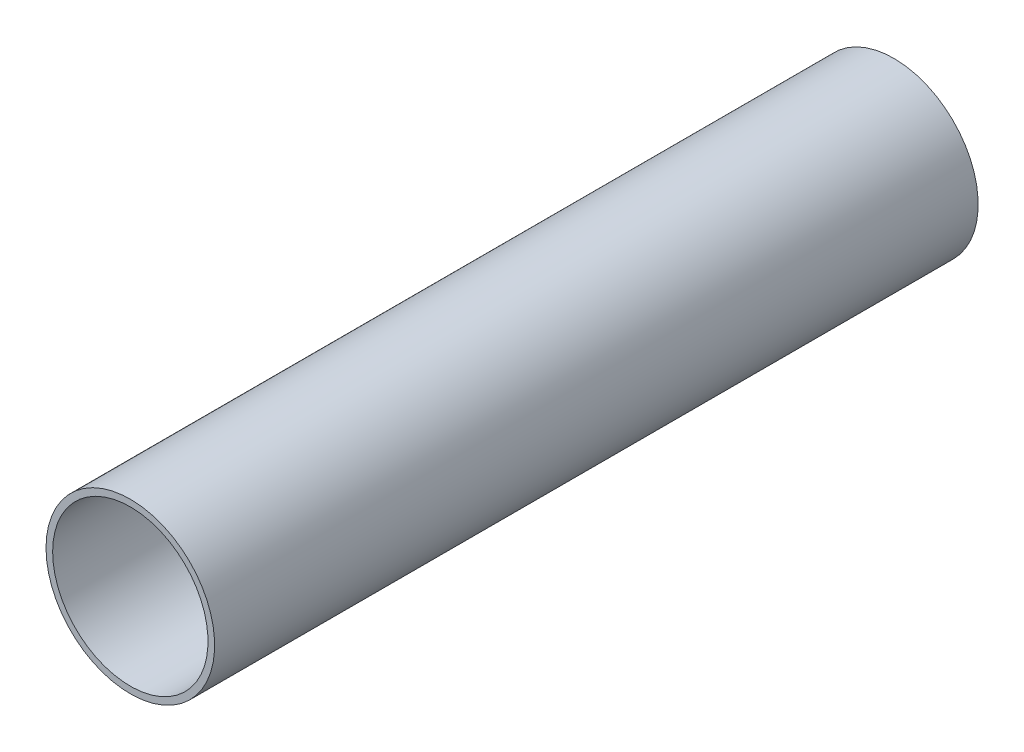
ISO-10303-21;
HEADER;
FILE_DESCRIPTION(('STEP AP214'),'2;1');
FILE_NAME('part.step','',(''),(''),'','','');
FILE_SCHEMA(('AUTOMOTIVE_DESIGN { 1 0 10303 214 1 1 1 1 }'));
ENDSEC;
DATA;
#1=APPLICATION_CONTEXT('core data for automotive mechanical design processes');
#2=APPLICATION_PROTOCOL_DEFINITION('international standard','automotive_design',2000,#1);
#3=PRODUCT_CONTEXT('',#1,'mechanical');
#4=PRODUCT('Part','Part','',(#3));
#5=PRODUCT_RELATED_PRODUCT_CATEGORY('part','',(#4));
#6=PRODUCT_DEFINITION_FORMATION('','',#4);
#7=PRODUCT_DEFINITION_CONTEXT('part definition',#1,'design');
#8=PRODUCT_DEFINITION('design','',#6,#7);
#9=PRODUCT_DEFINITION_SHAPE('','',#8);
#10=(LENGTH_UNIT() NAMED_UNIT(*) SI_UNIT(.MILLI.,.METRE.));
#11=(NAMED_UNIT(*) PLANE_ANGLE_UNIT() SI_UNIT($,.RADIAN.));
#12=(NAMED_UNIT(*) SI_UNIT($,.STERADIAN.) SOLID_ANGLE_UNIT());
#13=UNCERTAINTY_MEASURE_WITH_UNIT(LENGTH_MEASURE(1.E-05),#10,'distance_accuracy_value','');
#14=(GEOMETRIC_REPRESENTATION_CONTEXT(3) GLOBAL_UNCERTAINTY_ASSIGNED_CONTEXT((#13)) GLOBAL_UNIT_ASSIGNED_CONTEXT((#10,
#11,#12)) REPRESENTATION_CONTEXT('',''));
#15=CARTESIAN_POINT('',(0.,0.,0.));
#16=DIRECTION('',(0.,0.,1.));
#17=DIRECTION('',(1.,0.,0.));
#18=AXIS2_PLACEMENT_3D('',#15,#16,#17);
#19=CARTESIAN_POINT('',(0.,0.,0.));
#20=DIRECTION('',(0.,0.,-1.));
#21=DIRECTION('',(-1.,0.,0.));
#22=AXIS2_PLACEMENT_3D('',#19,#20,#21);
#23=PLANE('',#22);
#24=CARTESIAN_POINT('',(0.,0.,0.));
#25=DIRECTION('',(0.,0.,-1.));
#26=DIRECTION('',(-1.,0.,0.));
#27=AXIS2_PLACEMENT_3D('',#24,#25,#26);
#28=CIRCLE('',#27,11.7);
#29=CARTESIAN_POINT('',(-11.7,0.,0.));
#30=VERTEX_POINT('',#29);
#31=EDGE_CURVE('E55',#30,#30,#28,.T.);
#32=ORIENTED_EDGE('',*,*,#31,.T.);
#33=EDGE_LOOP('',(#32));
#34=FACE_BOUND('',#33,.T.);
#35=CARTESIAN_POINT('',(0.,0.,0.));
#36=DIRECTION('',(0.,0.,-1.));
#37=DIRECTION('',(-1.,0.,0.));
#38=AXIS2_PLACEMENT_3D('',#35,#36,#37);
#39=CIRCLE('',#38,12.7);
#40=CARTESIAN_POINT('',(-12.7,0.,0.));
#41=VERTEX_POINT('',#40);
#42=EDGE_CURVE('E47',#41,#41,#39,.T.);
#43=ORIENTED_EDGE('',*,*,#42,.F.);
#44=EDGE_LOOP('',(#43));
#45=FACE_BOUND('',#44,.T.);
#46=ADVANCED_FACE('F41',(#34,#45),#23,.F.);
#47=CARTESIAN_POINT('',(0.,0.,-115.));
#48=DIRECTION('',(0.,0.,-1.));
#49=DIRECTION('',(-1.,0.,0.));
#50=AXIS2_PLACEMENT_3D('',#47,#48,#49);
#51=PLANE('',#50);
#52=CARTESIAN_POINT('',(0.,0.,-115.));
#53=DIRECTION('',(0.,0.,-1.));
#54=DIRECTION('',(-1.,0.,0.));
#55=AXIS2_PLACEMENT_3D('',#52,#53,#54);
#56=CIRCLE('',#55,11.7);
#57=CARTESIAN_POINT('',(-11.7,0.,-115.));
#58=VERTEX_POINT('',#57);
#59=EDGE_CURVE('E51',#58,#58,#56,.T.);
#60=ORIENTED_EDGE('',*,*,#59,.F.);
#61=EDGE_LOOP('',(#60));
#62=FACE_BOUND('',#61,.T.);
#63=CARTESIAN_POINT('',(0.,0.,-115.));
#64=DIRECTION('',(0.,0.,-1.));
#65=DIRECTION('',(-1.,0.,0.));
#66=AXIS2_PLACEMENT_3D('',#63,#64,#65);
#67=CIRCLE('',#66,12.7);
#68=CARTESIAN_POINT('',(-12.7,0.,-115.));
#69=VERTEX_POINT('',#68);
#70=EDGE_CURVE('E11',#69,#69,#67,.T.);
#71=ORIENTED_EDGE('',*,*,#70,.T.);
#72=EDGE_LOOP('',(#71));
#73=FACE_BOUND('',#72,.T.);
#74=ADVANCED_FACE('F71',(#62,#73),#51,.T.);
#75=CARTESIAN_POINT('',(0.,0.,0.));
#76=DIRECTION('',(0.,0.,-1.));
#77=DIRECTION('',(-1.,0.,0.));
#78=AXIS2_PLACEMENT_3D('',#75,#76,#77);
#79=CYLINDRICAL_SURFACE('',#78,12.7);
#80=ORIENTED_EDGE('',*,*,#70,.F.);
#81=EDGE_LOOP('',(#80));
#82=FACE_BOUND('',#81,.T.);
#83=ORIENTED_EDGE('',*,*,#42,.T.);
#84=EDGE_LOOP('',(#83));
#85=FACE_BOUND('',#84,.T.);
#86=ADVANCED_FACE('F65',(#82,#85),#79,.T.);
#87=CARTESIAN_POINT('',(0.,0.,0.));
#88=DIRECTION('',(0.,0.,-1.));
#89=DIRECTION('',(-1.,0.,0.));
#90=AXIS2_PLACEMENT_3D('',#87,#88,#89);
#91=CYLINDRICAL_SURFACE('',#90,11.7);
#92=ORIENTED_EDGE('',*,*,#59,.T.);
#93=EDGE_LOOP('',(#92));
#94=FACE_BOUND('',#93,.T.);
#95=ORIENTED_EDGE('',*,*,#31,.F.);
#96=EDGE_LOOP('',(#95));
#97=FACE_BOUND('',#96,.T.);
#98=ADVANCED_FACE('F63',(#94,#97),#91,.F.);
#99=CLOSED_SHELL('',(#46,#74,#86,#98));
#100=MANIFOLD_SOLID_BREP('B2',#99);
#101=ADVANCED_BREP_SHAPE_REPRESENTATION('',(#18,#100),#14);
#102=SHAPE_DEFINITION_REPRESENTATION(#9,#101);
ENDSEC;
END-ISO-10303-21;
